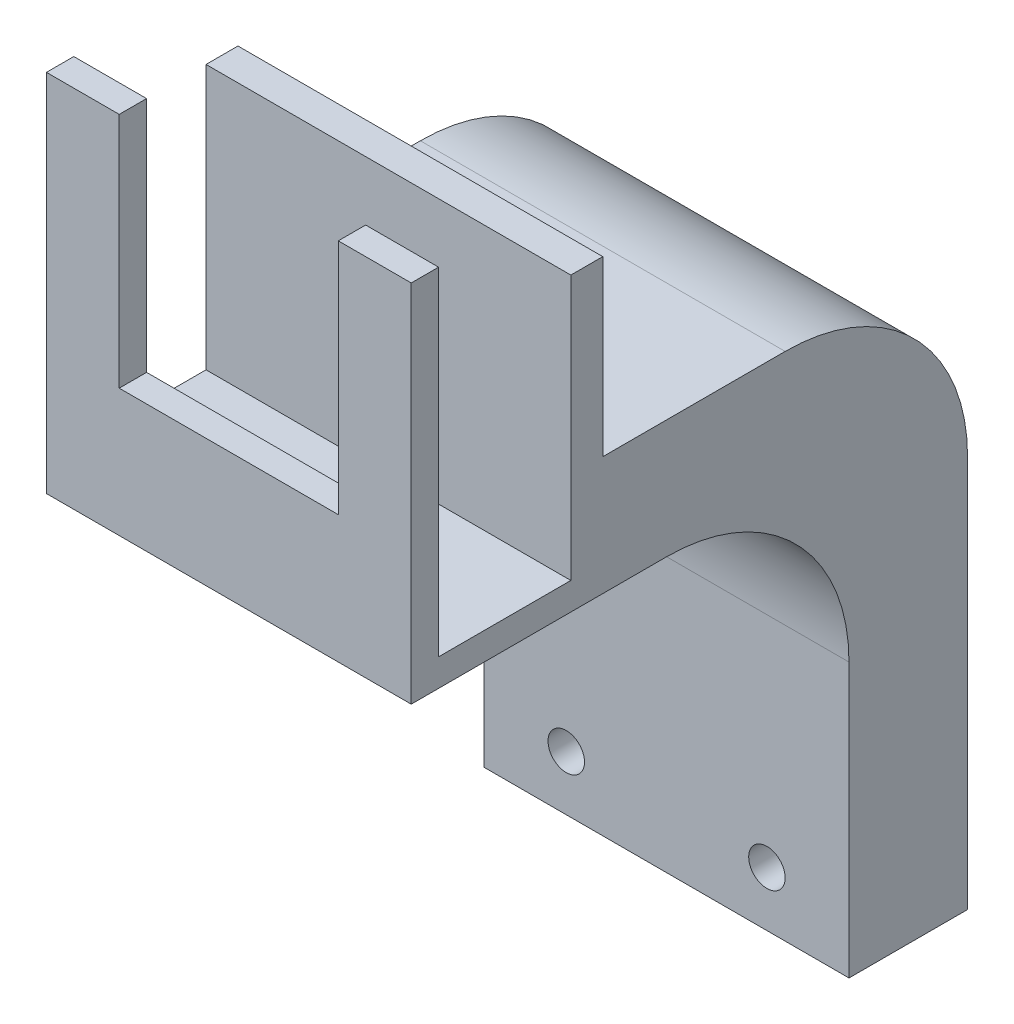
ISO-10303-21;
HEADER;
FILE_DESCRIPTION(('STEP AP214'),'2;1');
FILE_NAME('part.step','',(''),(''),'','','');
FILE_SCHEMA(('AUTOMOTIVE_DESIGN { 1 0 10303 214 1 1 1 1 }'));
ENDSEC;
DATA;
#1=APPLICATION_CONTEXT('core data for automotive mechanical design processes');
#2=APPLICATION_PROTOCOL_DEFINITION('international standard','automotive_design',2000,#1);
#3=PRODUCT_CONTEXT('',#1,'mechanical');
#4=PRODUCT('Part','Part','',(#3));
#5=PRODUCT_RELATED_PRODUCT_CATEGORY('part','',(#4));
#6=PRODUCT_DEFINITION_FORMATION('','',#4);
#7=PRODUCT_DEFINITION_CONTEXT('part definition',#1,'design');
#8=PRODUCT_DEFINITION('design','',#6,#7);
#9=PRODUCT_DEFINITION_SHAPE('','',#8);
#10=(LENGTH_UNIT() NAMED_UNIT(*) SI_UNIT(.MILLI.,.METRE.));
#11=(NAMED_UNIT(*) PLANE_ANGLE_UNIT() SI_UNIT($,.RADIAN.));
#12=(NAMED_UNIT(*) SI_UNIT($,.STERADIAN.) SOLID_ANGLE_UNIT());
#13=UNCERTAINTY_MEASURE_WITH_UNIT(LENGTH_MEASURE(1.E-05),#10,'distance_accuracy_value','');
#14=(GEOMETRIC_REPRESENTATION_CONTEXT(3) GLOBAL_UNCERTAINTY_ASSIGNED_CONTEXT((#13)) GLOBAL_UNIT_ASSIGNED_CONTEXT((#10,
#11,#12)) REPRESENTATION_CONTEXT('',''));
#15=CARTESIAN_POINT('',(0.,0.,0.));
#16=DIRECTION('',(0.,0.,1.));
#17=DIRECTION('',(1.,0.,0.));
#18=AXIS2_PLACEMENT_3D('',#15,#16,#17);
#19=CARTESIAN_POINT('',(0.,-7.,-20.));
#20=DIRECTION('',(1.,0.,0.));
#21=DIRECTION('',(0.,0.,-1.));
#22=AXIS2_PLACEMENT_3D('',#19,#20,#21);
#23=CYLINDRICAL_SURFACE('',#22,20.);
#24=DIRECTION('',(1.,0.,0.));
#25=VECTOR('',#24,1.);
#26=CARTESIAN_POINT('',(0.,-7.,-40.));
#27=LINE('',#26,#25);
#28=CARTESIAN_POINT('',(0.,-7.,-40.));
#29=VERTEX_POINT('',#28);
#30=CARTESIAN_POINT('',(40.,-7.,-40.));
#31=VERTEX_POINT('',#30);
#32=EDGE_CURVE('E359',#29,#31,#27,.T.);
#33=ORIENTED_EDGE('',*,*,#32,.F.);
#34=CARTESIAN_POINT('',(0.,-7.,-20.));
#35=DIRECTION('',(1.,0.,0.));
#36=DIRECTION('',(0.,0.,-1.));
#37=AXIS2_PLACEMENT_3D('',#34,#35,#36);
#38=CIRCLE('',#37,20.);
#39=CARTESIAN_POINT('',(0.,13.,-20.));
#40=VERTEX_POINT('',#39);
#41=EDGE_CURVE('E49',#40,#29,#38,.F.);
#42=ORIENTED_EDGE('',*,*,#41,.F.);
#43=DIRECTION('',(1.,0.,0.));
#44=VECTOR('',#43,1.);
#45=CARTESIAN_POINT('',(0.,13.,-20.));
#46=LINE('',#45,#44);
#47=CARTESIAN_POINT('',(40.,13.,-20.));
#48=VERTEX_POINT('',#47);
#49=EDGE_CURVE('E362',#48,#40,#46,.F.);
#50=ORIENTED_EDGE('',*,*,#49,.F.);
#51=CARTESIAN_POINT('',(40.,-7.,-20.));
#52=DIRECTION('',(-1.,0.,0.));
#53=DIRECTION('',(0.,0.,1.));
#54=AXIS2_PLACEMENT_3D('',#51,#52,#53);
#55=CIRCLE('',#54,20.);
#56=EDGE_CURVE('E11',#31,#48,#55,.F.);
#57=ORIENTED_EDGE('',*,*,#56,.F.);
#58=EDGE_LOOP('',(#33,#42,#50,#57));
#59=FACE_BOUND('',#58,.T.);
#60=ADVANCED_FACE('F41',(#59),#23,.T.);
#61=CARTESIAN_POINT('',(0.,-20.,-7.));
#62=DIRECTION('',(1.,0.,0.));
#63=DIRECTION('',(0.,0.,-1.));
#64=AXIS2_PLACEMENT_3D('',#61,#62,#63);
#65=CYLINDRICAL_SURFACE('',#64,20.);
#66=DIRECTION('',(-1.,0.,0.));
#67=VECTOR('',#66,1.);
#68=CARTESIAN_POINT('',(0.,-20.,-27.));
#69=LINE('',#68,#67);
#70=CARTESIAN_POINT('',(40.,-20.,-27.));
#71=VERTEX_POINT('',#70);
#72=CARTESIAN_POINT('',(0.,-20.,-27.));
#73=VERTEX_POINT('',#72);
#74=EDGE_CURVE('E345',#71,#73,#69,.T.);
#75=ORIENTED_EDGE('',*,*,#74,.F.);
#76=CARTESIAN_POINT('',(40.,-20.,-7.));
#77=DIRECTION('',(-1.,0.,0.));
#78=DIRECTION('',(0.,0.,1.));
#79=AXIS2_PLACEMENT_3D('',#76,#77,#78);
#80=CIRCLE('',#79,20.);
#81=CARTESIAN_POINT('',(40.,0.,-7.));
#82=VERTEX_POINT('',#81);
#83=EDGE_CURVE('E353',#71,#82,#80,.F.);
#84=ORIENTED_EDGE('',*,*,#83,.T.);
#85=DIRECTION('',(-1.,0.,0.));
#86=VECTOR('',#85,1.);
#87=CARTESIAN_POINT('',(0.,0.,-7.));
#88=LINE('',#87,#86);
#89=CARTESIAN_POINT('',(0.,0.,-6.99999999999999));
#90=VERTEX_POINT('',#89);
#91=EDGE_CURVE('E349',#90,#82,#88,.F.);
#92=ORIENTED_EDGE('',*,*,#91,.F.);
#93=CARTESIAN_POINT('',(0.,-20.,-7.));
#94=DIRECTION('',(1.,0.,0.));
#95=DIRECTION('',(0.,0.,-1.));
#96=AXIS2_PLACEMENT_3D('',#93,#94,#95);
#97=CIRCLE('',#96,20.);
#98=EDGE_CURVE('E356',#90,#73,#97,.F.);
#99=ORIENTED_EDGE('',*,*,#98,.T.);
#100=EDGE_LOOP('',(#75,#84,#92,#99));
#101=FACE_BOUND('',#100,.T.);
#102=ADVANCED_FACE('F392',(#101),#65,.F.);
#103=CARTESIAN_POINT('',(0.,0.,21.));
#104=DIRECTION('',(0.,1.,0.));
#105=DIRECTION('',(0.,0.,1.));
#106=AXIS2_PLACEMENT_3D('',#103,#104,#105);
#107=PLANE('',#106);
#108=DIRECTION('',(0.,0.,-1.));
#109=VECTOR('',#108,1.);
#110=CARTESIAN_POINT('',(0.,0.,21.));
#111=LINE('',#110,#109);
#112=CARTESIAN_POINT('',(0.,0.,21.));
#113=VERTEX_POINT('',#112);
#114=EDGE_CURVE('E337',#113,#90,#111,.T.);
#115=ORIENTED_EDGE('',*,*,#114,.T.);
#116=ORIENTED_EDGE('',*,*,#91,.T.);
#117=DIRECTION('',(0.,0.,-1.));
#118=VECTOR('',#117,1.);
#119=CARTESIAN_POINT('',(40.,0.,21.));
#120=LINE('',#119,#118);
#121=CARTESIAN_POINT('',(40.,0.,21.));
#122=VERTEX_POINT('',#121);
#123=EDGE_CURVE('E333',#122,#82,#120,.T.);
#124=ORIENTED_EDGE('',*,*,#123,.F.);
#125=DIRECTION('',(1.,0.,0.));
#126=VECTOR('',#125,1.);
#127=CARTESIAN_POINT('',(0.,0.,21.));
#128=LINE('',#127,#126);
#129=EDGE_CURVE('E308',#113,#122,#128,.T.);
#130=ORIENTED_EDGE('',*,*,#129,.F.);
#131=EDGE_LOOP('',(#115,#116,#124,#130));
#132=FACE_BOUND('',#131,.T.);
#133=ADVANCED_FACE('F388',(#132),#107,.F.);
#134=CARTESIAN_POINT('',(40.,40.,21.));
#135=DIRECTION('',(0.,-1.,0.));
#136=DIRECTION('',(0.,0.,-1.));
#137=AXIS2_PLACEMENT_3D('',#134,#135,#136);
#138=PLANE('',#137);
#139=DIRECTION('',(0.,0.,1.));
#140=VECTOR('',#139,1.);
#141=CARTESIAN_POINT('',(32.,40.,-0.001000000000001));
#142=LINE('',#141,#140);
#143=CARTESIAN_POINT('',(32.,40.,18.));
#144=VERTEX_POINT('',#143);
#145=CARTESIAN_POINT('',(32.,40.,21.));
#146=VERTEX_POINT('',#145);
#147=EDGE_CURVE('E241',#144,#146,#142,.T.);
#148=ORIENTED_EDGE('',*,*,#147,.T.);
#149=DIRECTION('',(-1.,0.,0.));
#150=VECTOR('',#149,1.);
#151=CARTESIAN_POINT('',(40.,40.,21.));
#152=LINE('',#151,#150);
#153=CARTESIAN_POINT('',(40.,40.,21.));
#154=VERTEX_POINT('',#153);
#155=EDGE_CURVE('E316',#154,#146,#152,.T.);
#156=ORIENTED_EDGE('',*,*,#155,.F.);
#157=DIRECTION('',(0.,0.,-1.));
#158=VECTOR('',#157,1.);
#159=CARTESIAN_POINT('',(40.,40.,21.));
#160=LINE('',#159,#158);
#161=CARTESIAN_POINT('',(40.,40.,18.));
#162=VERTEX_POINT('',#161);
#163=EDGE_CURVE('E329',#154,#162,#160,.T.);
#164=ORIENTED_EDGE('',*,*,#163,.T.);
#165=DIRECTION('',(1.,0.,0.));
#166=VECTOR('',#165,1.);
#167=CARTESIAN_POINT('',(0.,40.,18.));
#168=LINE('',#167,#166);
#169=EDGE_CURVE('E282',#144,#162,#168,.T.);
#170=ORIENTED_EDGE('',*,*,#169,.F.);
#171=EDGE_LOOP('',(#148,#156,#164,#170));
#172=FACE_BOUND('',#171,.T.);
#173=ADVANCED_FACE('F380',(#172),#138,.F.);
#174=DIRECTION('',(0.,0.,1.));
#175=VECTOR('',#174,1.);
#176=CARTESIAN_POINT('',(7.9821955875414,40.,-0.001000000000001));
#177=LINE('',#176,#175);
#178=CARTESIAN_POINT('',(7.9821955875414,40.,18.));
#179=VERTEX_POINT('',#178);
#180=CARTESIAN_POINT('',(7.9821955875414,40.,21.));
#181=VERTEX_POINT('',#180);
#182=EDGE_CURVE('E240',#179,#181,#177,.T.);
#183=ORIENTED_EDGE('',*,*,#182,.F.);
#184=CARTESIAN_POINT('',(0.,40.,18.));
#185=VERTEX_POINT('',#184);
#186=EDGE_CURVE('E300',#185,#179,#168,.T.);
#187=ORIENTED_EDGE('',*,*,#186,.F.);
#188=DIRECTION('',(0.,0.,-1.));
#189=VECTOR('',#188,1.);
#190=CARTESIAN_POINT('',(0.,40.,21.));
#191=LINE('',#190,#189);
#192=CARTESIAN_POINT('',(0.,40.,21.));
#193=VERTEX_POINT('',#192);
#194=EDGE_CURVE('E320',#193,#185,#191,.T.);
#195=ORIENTED_EDGE('',*,*,#194,.F.);
#196=EDGE_CURVE('E315',#181,#193,#152,.T.);
#197=ORIENTED_EDGE('',*,*,#196,.F.);
#198=EDGE_LOOP('',(#183,#187,#195,#197));
#199=FACE_BOUND('',#198,.T.);
#200=ADVANCED_FACE('F402',(#199),#138,.F.);
#201=CARTESIAN_POINT('',(0.,0.,21.));
#202=DIRECTION('',(0.,0.,1.));
#203=DIRECTION('',(1.,0.,0.));
#204=AXIS2_PLACEMENT_3D('',#201,#202,#203);
#205=PLANE('',#204);
#206=ORIENTED_EDGE('',*,*,#155,.T.);
#207=DIRECTION('',(0.,-1.,0.));
#208=VECTOR('',#207,1.);
#209=CARTESIAN_POINT('',(32.,0.,21.));
#210=LINE('',#209,#208);
#211=CARTESIAN_POINT('',(32.,14.,21.));
#212=VERTEX_POINT('',#211);
#213=EDGE_CURVE('E236',#146,#212,#210,.T.);
#214=ORIENTED_EDGE('',*,*,#213,.T.);
#215=DIRECTION('',(1.,0.,0.));
#216=VECTOR('',#215,1.);
#217=CARTESIAN_POINT('',(0.,14.,21.));
#218=LINE('',#217,#216);
#219=CARTESIAN_POINT('',(7.9821955875414,14.,21.));
#220=VERTEX_POINT('',#219);
#221=EDGE_CURVE('E235',#220,#212,#218,.T.);
#222=ORIENTED_EDGE('',*,*,#221,.F.);
#223=DIRECTION('',(0.,1.,0.));
#224=VECTOR('',#223,1.);
#225=CARTESIAN_POINT('',(7.9821955875414,0.,21.));
#226=LINE('',#225,#224);
#227=EDGE_CURVE('E246',#220,#181,#226,.T.);
#228=ORIENTED_EDGE('',*,*,#227,.T.);
#229=ORIENTED_EDGE('',*,*,#196,.T.);
#230=DIRECTION('',(0.,-1.,0.));
#231=VECTOR('',#230,1.);
#232=CARTESIAN_POINT('',(0.,40.,21.));
#233=LINE('',#232,#231);
#234=EDGE_CURVE('E304',#193,#113,#233,.T.);
#235=ORIENTED_EDGE('',*,*,#234,.T.);
#236=ORIENTED_EDGE('',*,*,#129,.T.);
#237=DIRECTION('',(0.,1.,0.));
#238=VECTOR('',#237,1.);
#239=CARTESIAN_POINT('',(40.,0.,21.));
#240=LINE('',#239,#238);
#241=EDGE_CURVE('E312',#122,#154,#240,.T.);
#242=ORIENTED_EDGE('',*,*,#241,.T.);
#243=EDGE_LOOP('',(#206,#214,#222,#228,#229,#235,#236,#242));
#244=FACE_BOUND('',#243,.T.);
#245=ADVANCED_FACE('F382',(#244),#205,.T.);
#246=CARTESIAN_POINT('',(0.,3.,18.));
#247=DIRECTION('',(0.,0.,1.));
#248=DIRECTION('',(1.,0.,0.));
#249=AXIS2_PLACEMENT_3D('',#246,#247,#248);
#250=PLANE('',#249);
#251=DIRECTION('',(0.,1.,0.));
#252=VECTOR('',#251,1.);
#253=CARTESIAN_POINT('',(32.,0.,18.));
#254=LINE('',#253,#252);
#255=CARTESIAN_POINT('',(32.,14.,18.));
#256=VERTEX_POINT('',#255);
#257=EDGE_CURVE('E256',#256,#144,#254,.T.);
#258=ORIENTED_EDGE('',*,*,#257,.T.);
#259=ORIENTED_EDGE('',*,*,#169,.T.);
#260=DIRECTION('',(0.,-1.,0.));
#261=VECTOR('',#260,1.);
#262=CARTESIAN_POINT('',(40.,3.,18.));
#263=LINE('',#262,#261);
#264=CARTESIAN_POINT('',(40.,3.,18.));
#265=VERTEX_POINT('',#264);
#266=EDGE_CURVE('E250',#162,#265,#263,.T.);
#267=ORIENTED_EDGE('',*,*,#266,.T.);
#268=DIRECTION('',(1.,0.,0.));
#269=VECTOR('',#268,1.);
#270=CARTESIAN_POINT('',(0.,3.,18.));
#271=LINE('',#270,#269);
#272=CARTESIAN_POINT('',(0.,3.,18.));
#273=VERTEX_POINT('',#272);
#274=EDGE_CURVE('E297',#273,#265,#271,.T.);
#275=ORIENTED_EDGE('',*,*,#274,.F.);
#276=DIRECTION('',(0.,-1.,0.));
#277=VECTOR('',#276,1.);
#278=CARTESIAN_POINT('',(0.,3.,18.));
#279=LINE('',#278,#277);
#280=EDGE_CURVE('E269',#185,#273,#279,.T.);
#281=ORIENTED_EDGE('',*,*,#280,.F.);
#282=ORIENTED_EDGE('',*,*,#186,.T.);
#283=DIRECTION('',(0.,-1.,0.));
#284=VECTOR('',#283,1.);
#285=CARTESIAN_POINT('',(7.9821955875414,0.,18.));
#286=LINE('',#285,#284);
#287=CARTESIAN_POINT('',(7.9821955875414,14.,18.));
#288=VERTEX_POINT('',#287);
#289=EDGE_CURVE('E252',#179,#288,#286,.T.);
#290=ORIENTED_EDGE('',*,*,#289,.T.);
#291=DIRECTION('',(-1.,0.,0.));
#292=VECTOR('',#291,1.);
#293=CARTESIAN_POINT('',(0.,14.,18.));
#294=LINE('',#293,#292);
#295=EDGE_CURVE('E229',#256,#288,#294,.T.);
#296=ORIENTED_EDGE('',*,*,#295,.F.);
#297=EDGE_LOOP('',(#258,#259,#267,#275,#281,#282,#290,#296));
#298=FACE_BOUND('',#297,.T.);
#299=ADVANCED_FACE('F370',(#298),#250,.F.);
#300=CARTESIAN_POINT('',(0.,40.,21.));
#301=DIRECTION('',(1.,0.,0.));
#302=DIRECTION('',(0.,0.,-1.));
#303=AXIS2_PLACEMENT_3D('',#300,#301,#302);
#304=PLANE('',#303);
#305=DIRECTION('',(0.,0.,1.));
#306=VECTOR('',#305,1.);
#307=CARTESIAN_POINT('',(0.,13.,-40.));
#308=LINE('',#307,#306);
#309=CARTESIAN_POINT('',(0.,13.,0.));
#310=VERTEX_POINT('',#309);
#311=EDGE_CURVE('E173',#40,#310,#308,.T.);
#312=ORIENTED_EDGE('',*,*,#311,.F.);
#313=ORIENTED_EDGE('',*,*,#41,.T.);
#314=DIRECTION('',(0.,1.,0.));
#315=VECTOR('',#314,1.);
#316=CARTESIAN_POINT('',(0.,0.,-40.));
#317=LINE('',#316,#315);
#318=CARTESIAN_POINT('',(0.,-50.,-40.));
#319=VERTEX_POINT('',#318);
#320=EDGE_CURVE('E163',#319,#29,#317,.T.);
#321=ORIENTED_EDGE('',*,*,#320,.F.);
#322=DIRECTION('',(0.,0.,-1.));
#323=VECTOR('',#322,1.);
#324=CARTESIAN_POINT('',(0.,-50.,-27.));
#325=LINE('',#324,#323);
#326=CARTESIAN_POINT('',(0.,-50.,-27.));
#327=VERTEX_POINT('',#326);
#328=EDGE_CURVE('E169',#327,#319,#325,.T.);
#329=ORIENTED_EDGE('',*,*,#328,.F.);
#330=DIRECTION('',(0.,1.,0.));
#331=VECTOR('',#330,1.);
#332=CARTESIAN_POINT('',(0.,-50.,-27.));
#333=LINE('',#332,#331);
#334=EDGE_CURVE('E203',#327,#73,#333,.T.);
#335=ORIENTED_EDGE('',*,*,#334,.T.);
#336=ORIENTED_EDGE('',*,*,#98,.F.);
#337=ORIENTED_EDGE('',*,*,#114,.F.);
#338=ORIENTED_EDGE('',*,*,#234,.F.);
#339=ORIENTED_EDGE('',*,*,#194,.T.);
#340=ORIENTED_EDGE('',*,*,#280,.T.);
#341=DIRECTION('',(0.,0.,-1.));
#342=VECTOR('',#341,1.);
#343=CARTESIAN_POINT('',(0.,3.,3.5));
#344=LINE('',#343,#342);
#345=CARTESIAN_POINT('',(0.,3.,3.5));
#346=VERTEX_POINT('',#345);
#347=EDGE_CURVE('E273',#273,#346,#344,.T.);
#348=ORIENTED_EDGE('',*,*,#347,.T.);
#349=DIRECTION('',(0.,1.,0.));
#350=VECTOR('',#349,1.);
#351=CARTESIAN_POINT('',(0.,40.,3.5));
#352=LINE('',#351,#350);
#353=CARTESIAN_POINT('',(0.,32.,3.5));
#354=VERTEX_POINT('',#353);
#355=EDGE_CURVE('E278',#346,#354,#352,.T.);
#356=ORIENTED_EDGE('',*,*,#355,.T.);
#357=DIRECTION('',(0.,0.,-1.));
#358=VECTOR('',#357,1.);
#359=CARTESIAN_POINT('',(0.,32.,16.));
#360=LINE('',#359,#358);
#361=CARTESIAN_POINT('',(0.,32.,0.));
#362=VERTEX_POINT('',#361);
#363=EDGE_CURVE('E225',#354,#362,#360,.T.);
#364=ORIENTED_EDGE('',*,*,#363,.T.);
#365=DIRECTION('',(0.,-1.,0.));
#366=VECTOR('',#365,1.);
#367=CARTESIAN_POINT('',(0.,40.,0.));
#368=LINE('',#367,#366);
#369=EDGE_CURVE('E296',#362,#310,#368,.T.);
#370=ORIENTED_EDGE('',*,*,#369,.T.);
#371=EDGE_LOOP('',(#312,#313,#321,#329,#335,#336,#337,#338,#339,#340,#348,#356,#364,#370));
#372=FACE_BOUND('',#371,.T.);
#373=ADVANCED_FACE('F166',(#372),#304,.F.);
#374=CARTESIAN_POINT('',(40.,0.,21.));
#375=DIRECTION('',(-1.,0.,0.));
#376=DIRECTION('',(0.,0.,1.));
#377=AXIS2_PLACEMENT_3D('',#374,#375,#376);
#378=PLANE('',#377);
#379=DIRECTION('',(0.,-1.,0.));
#380=VECTOR('',#379,1.);
#381=CARTESIAN_POINT('',(40.,0.,-40.));
#382=LINE('',#381,#380);
#383=CARTESIAN_POINT('',(40.,-50.,-40.));
#384=VERTEX_POINT('',#383);
#385=EDGE_CURVE('E174',#31,#384,#382,.T.);
#386=ORIENTED_EDGE('',*,*,#385,.F.);
#387=ORIENTED_EDGE('',*,*,#56,.T.);
#388=DIRECTION('',(0.,0.,1.));
#389=VECTOR('',#388,1.);
#390=CARTESIAN_POINT('',(40.,13.,-40.));
#391=LINE('',#390,#389);
#392=CARTESIAN_POINT('',(40.,13.,0.));
#393=VERTEX_POINT('',#392);
#394=EDGE_CURVE('E218',#48,#393,#391,.T.);
#395=ORIENTED_EDGE('',*,*,#394,.T.);
#396=DIRECTION('',(0.,1.,0.));
#397=VECTOR('',#396,1.);
#398=CARTESIAN_POINT('',(40.,0.,0.));
#399=LINE('',#398,#397);
#400=CARTESIAN_POINT('',(40.,32.,0.));
#401=VERTEX_POINT('',#400);
#402=EDGE_CURVE('E309',#393,#401,#399,.T.);
#403=ORIENTED_EDGE('',*,*,#402,.T.);
#404=DIRECTION('',(0.,0.,-1.));
#405=VECTOR('',#404,1.);
#406=CARTESIAN_POINT('',(40.,32.,16.));
#407=LINE('',#406,#405);
#408=CARTESIAN_POINT('',(40.,32.,3.5));
#409=VERTEX_POINT('',#408);
#410=EDGE_CURVE('E224',#409,#401,#407,.T.);
#411=ORIENTED_EDGE('',*,*,#410,.F.);
#412=DIRECTION('',(0.,1.,0.));
#413=VECTOR('',#412,1.);
#414=CARTESIAN_POINT('',(40.,40.,3.5));
#415=LINE('',#414,#413);
#416=CARTESIAN_POINT('',(40.,3.,3.5));
#417=VERTEX_POINT('',#416);
#418=EDGE_CURVE('E274',#417,#409,#415,.T.);
#419=ORIENTED_EDGE('',*,*,#418,.F.);
#420=DIRECTION('',(0.,0.,-1.));
#421=VECTOR('',#420,1.);
#422=CARTESIAN_POINT('',(40.,3.,3.5));
#423=LINE('',#422,#421);
#424=EDGE_CURVE('E286',#265,#417,#423,.T.);
#425=ORIENTED_EDGE('',*,*,#424,.F.);
#426=ORIENTED_EDGE('',*,*,#266,.F.);
#427=ORIENTED_EDGE('',*,*,#163,.F.);
#428=ORIENTED_EDGE('',*,*,#241,.F.);
#429=ORIENTED_EDGE('',*,*,#123,.T.);
#430=ORIENTED_EDGE('',*,*,#83,.F.);
#431=DIRECTION('',(0.,1.,0.));
#432=VECTOR('',#431,1.);
#433=CARTESIAN_POINT('',(40.,-50.,-27.));
#434=LINE('',#433,#432);
#435=CARTESIAN_POINT('',(40.,-50.,-27.));
#436=VERTEX_POINT('',#435);
#437=EDGE_CURVE('E206',#436,#71,#434,.T.);
#438=ORIENTED_EDGE('',*,*,#437,.F.);
#439=DIRECTION('',(0.,0.,1.));
#440=VECTOR('',#439,1.);
#441=CARTESIAN_POINT('',(40.,-50.,-27.));
#442=LINE('',#441,#440);
#443=EDGE_CURVE('E182',#384,#436,#442,.T.);
#444=ORIENTED_EDGE('',*,*,#443,.F.);
#445=EDGE_LOOP('',(#386,#387,#395,#403,#411,#419,#425,#426,#427,#428,#429,#430,#438,#444));
#446=FACE_BOUND('',#445,.T.);
#447=ADVANCED_FACE('F376',(#446),#378,.F.);
#448=CARTESIAN_POINT('',(0.,0.,0.));
#449=DIRECTION('',(0.,0.,1.));
#450=DIRECTION('',(1.,0.,0.));
#451=AXIS2_PLACEMENT_3D('',#448,#449,#450);
#452=PLANE('',#451);
#453=ORIENTED_EDGE('',*,*,#402,.F.);
#454=DIRECTION('',(-1.,0.,0.));
#455=VECTOR('',#454,1.);
#456=CARTESIAN_POINT('',(0.,13.,0.));
#457=LINE('',#456,#455);
#458=EDGE_CURVE('E210',#393,#310,#457,.T.);
#459=ORIENTED_EDGE('',*,*,#458,.T.);
#460=ORIENTED_EDGE('',*,*,#369,.F.);
#461=DIRECTION('',(-1.,0.,0.));
#462=VECTOR('',#461,1.);
#463=CARTESIAN_POINT('',(40.,32.,0.));
#464=LINE('',#463,#462);
#465=EDGE_CURVE('E221',#401,#362,#464,.T.);
#466=ORIENTED_EDGE('',*,*,#465,.F.);
#467=EDGE_LOOP('',(#453,#459,#460,#466));
#468=FACE_BOUND('',#467,.T.);
#469=ADVANCED_FACE('F417',(#468),#452,.F.);
#470=CARTESIAN_POINT('',(0.,40.,3.5));
#471=DIRECTION('',(0.,0.,-1.));
#472=DIRECTION('',(0.,1.,0.));
#473=AXIS2_PLACEMENT_3D('',#470,#471,#472);
#474=PLANE('',#473);
#475=ORIENTED_EDGE('',*,*,#418,.T.);
#476=DIRECTION('',(-1.,0.,0.));
#477=VECTOR('',#476,1.);
#478=CARTESIAN_POINT('',(0.,32.,3.5));
#479=LINE('',#478,#477);
#480=EDGE_CURVE('E341',#409,#354,#479,.T.);
#481=ORIENTED_EDGE('',*,*,#480,.T.);
#482=ORIENTED_EDGE('',*,*,#355,.F.);
#483=DIRECTION('',(1.,0.,0.));
#484=VECTOR('',#483,1.);
#485=CARTESIAN_POINT('',(0.,3.,3.5));
#486=LINE('',#485,#484);
#487=EDGE_CURVE('E293',#346,#417,#486,.T.);
#488=ORIENTED_EDGE('',*,*,#487,.T.);
#489=EDGE_LOOP('',(#475,#481,#482,#488));
#490=FACE_BOUND('',#489,.T.);
#491=ADVANCED_FACE('F408',(#490),#474,.F.);
#492=CARTESIAN_POINT('',(0.,3.,3.5));
#493=DIRECTION('',(0.,-1.,0.));
#494=DIRECTION('',(0.,0.,-1.));
#495=AXIS2_PLACEMENT_3D('',#492,#493,#494);
#496=PLANE('',#495);
#497=ORIENTED_EDGE('',*,*,#424,.T.);
#498=ORIENTED_EDGE('',*,*,#487,.F.);
#499=ORIENTED_EDGE('',*,*,#347,.F.);
#500=ORIENTED_EDGE('',*,*,#274,.T.);
#501=EDGE_LOOP('',(#497,#498,#499,#500));
#502=FACE_BOUND('',#501,.T.);
#503=ADVANCED_FACE('F406',(#502),#496,.F.);
#504=CARTESIAN_POINT('',(0.,14.,-0.001000000000001));
#505=DIRECTION('',(0.,-1.,0.));
#506=DIRECTION('',(0.,0.,-1.));
#507=AXIS2_PLACEMENT_3D('',#504,#505,#506);
#508=PLANE('',#507);
#509=ORIENTED_EDGE('',*,*,#295,.T.);
#510=DIRECTION('',(0.,0.,1.));
#511=VECTOR('',#510,1.);
#512=CARTESIAN_POINT('',(7.9821955875414,14.,-0.001000000000001));
#513=LINE('',#512,#511);
#514=EDGE_CURVE('E251',#288,#220,#513,.T.);
#515=ORIENTED_EDGE('',*,*,#514,.T.);
#516=ORIENTED_EDGE('',*,*,#221,.T.);
#517=DIRECTION('',(0.,0.,1.));
#518=VECTOR('',#517,1.);
#519=CARTESIAN_POINT('',(32.,14.,-0.001000000000001));
#520=LINE('',#519,#518);
#521=EDGE_CURVE('E245',#256,#212,#520,.T.);
#522=ORIENTED_EDGE('',*,*,#521,.F.);
#523=EDGE_LOOP('',(#509,#515,#516,#522));
#524=FACE_BOUND('',#523,.T.);
#525=ADVANCED_FACE('F444',(#524),#508,.F.);
#526=CARTESIAN_POINT('',(32.,0.,-0.001000000000001));
#527=DIRECTION('',(-1.,0.,0.));
#528=DIRECTION('',(0.,0.,1.));
#529=AXIS2_PLACEMENT_3D('',#526,#527,#528);
#530=PLANE('',#529);
#531=ORIENTED_EDGE('',*,*,#521,.T.);
#532=ORIENTED_EDGE('',*,*,#213,.F.);
#533=ORIENTED_EDGE('',*,*,#147,.F.);
#534=ORIENTED_EDGE('',*,*,#257,.F.);
#535=EDGE_LOOP('',(#531,#532,#533,#534));
#536=FACE_BOUND('',#535,.T.);
#537=ADVANCED_FACE('F449',(#536),#530,.T.);
#538=CARTESIAN_POINT('',(7.9821955875414,0.,-0.001000000000001));
#539=DIRECTION('',(1.,0.,0.));
#540=DIRECTION('',(0.,0.,-1.));
#541=AXIS2_PLACEMENT_3D('',#538,#539,#540);
#542=PLANE('',#541);
#543=ORIENTED_EDGE('',*,*,#182,.T.);
#544=ORIENTED_EDGE('',*,*,#227,.F.);
#545=ORIENTED_EDGE('',*,*,#514,.F.);
#546=ORIENTED_EDGE('',*,*,#289,.F.);
#547=EDGE_LOOP('',(#543,#544,#545,#546));
#548=FACE_BOUND('',#547,.T.);
#549=ADVANCED_FACE('F453',(#548),#542,.T.);
#550=CARTESIAN_POINT('',(40.,32.,16.));
#551=DIRECTION('',(0.,-1.,0.));
#552=DIRECTION('',(0.,0.,-1.));
#553=AXIS2_PLACEMENT_3D('',#550,#551,#552);
#554=PLANE('',#553);
#555=ORIENTED_EDGE('',*,*,#410,.T.);
#556=ORIENTED_EDGE('',*,*,#465,.T.);
#557=ORIENTED_EDGE('',*,*,#363,.F.);
#558=ORIENTED_EDGE('',*,*,#480,.F.);
#559=EDGE_LOOP('',(#555,#556,#557,#558));
#560=FACE_BOUND('',#559,.T.);
#561=ADVANCED_FACE('F411',(#560),#554,.F.);
#562=CARTESIAN_POINT('',(0.,13.,-40.));
#563=DIRECTION('',(0.,1.,0.));
#564=DIRECTION('',(0.,0.,1.));
#565=AXIS2_PLACEMENT_3D('',#562,#563,#564);
#566=PLANE('',#565);
#567=ORIENTED_EDGE('',*,*,#394,.F.);
#568=ORIENTED_EDGE('',*,*,#49,.T.);
#569=ORIENTED_EDGE('',*,*,#311,.T.);
#570=ORIENTED_EDGE('',*,*,#458,.F.);
#571=EDGE_LOOP('',(#567,#568,#569,#570));
#572=FACE_BOUND('',#571,.T.);
#573=ADVANCED_FACE('F420',(#572),#566,.T.);
#574=CARTESIAN_POINT('',(0.,0.,-40.));
#575=DIRECTION('',(0.,0.,-1.));
#576=DIRECTION('',(-1.,0.,0.));
#577=AXIS2_PLACEMENT_3D('',#574,#575,#576);
#578=PLANE('',#577);
#579=CARTESIAN_POINT('',(31.,-44.,-40.));
#580=DIRECTION('',(0.,0.,-1.));
#581=DIRECTION('',(-1.,0.,0.));
#582=AXIS2_PLACEMENT_3D('',#579,#580,#581);
#583=CIRCLE('',#582,2.);
#584=CARTESIAN_POINT('',(29.,-44.,-40.));
#585=VERTEX_POINT('',#584);
#586=EDGE_CURVE('E193',#585,#585,#583,.T.);
#587=ORIENTED_EDGE('',*,*,#586,.F.);
#588=EDGE_LOOP('',(#587));
#589=FACE_BOUND('',#588,.T.);
#590=CARTESIAN_POINT('',(9.,-44.,-40.));
#591=DIRECTION('',(0.,0.,-1.));
#592=DIRECTION('',(-1.,0.,0.));
#593=AXIS2_PLACEMENT_3D('',#590,#591,#592);
#594=CIRCLE('',#593,2.);
#595=CARTESIAN_POINT('',(7.,-44.,-40.));
#596=VERTEX_POINT('',#595);
#597=EDGE_CURVE('E488',#596,#596,#594,.T.);
#598=ORIENTED_EDGE('',*,*,#597,.F.);
#599=EDGE_LOOP('',(#598));
#600=FACE_BOUND('',#599,.T.);
#601=ORIENTED_EDGE('',*,*,#320,.T.);
#602=ORIENTED_EDGE('',*,*,#32,.T.);
#603=ORIENTED_EDGE('',*,*,#385,.T.);
#604=DIRECTION('',(1.,0.,0.));
#605=VECTOR('',#604,1.);
#606=CARTESIAN_POINT('',(0.,-50.,-40.));
#607=LINE('',#606,#605);
#608=EDGE_CURVE('E177',#319,#384,#607,.T.);
#609=ORIENTED_EDGE('',*,*,#608,.F.);
#610=EDGE_LOOP('',(#601,#602,#603,#609));
#611=FACE_BOUND('',#610,.T.);
#612=ADVANCED_FACE('F178',(#589,#600,#611),#578,.T.);
#613=CARTESIAN_POINT('',(0.,-50.,-27.));
#614=DIRECTION('',(0.,0.,-1.));
#615=DIRECTION('',(-1.,0.,0.));
#616=AXIS2_PLACEMENT_3D('',#613,#614,#615);
#617=PLANE('',#616);
#618=CARTESIAN_POINT('',(31.,-44.,-27.));
#619=DIRECTION('',(0.,0.,-1.));
#620=DIRECTION('',(-1.,0.,0.));
#621=AXIS2_PLACEMENT_3D('',#618,#619,#620);
#622=CIRCLE('',#621,2.);
#623=CARTESIAN_POINT('',(29.,-44.,-27.));
#624=VERTEX_POINT('',#623);
#625=EDGE_CURVE('E189',#624,#624,#622,.F.);
#626=ORIENTED_EDGE('',*,*,#625,.F.);
#627=EDGE_LOOP('',(#626));
#628=FACE_BOUND('',#627,.T.);
#629=CARTESIAN_POINT('',(9.,-44.,-27.));
#630=DIRECTION('',(0.,0.,-1.));
#631=DIRECTION('',(-1.,0.,0.));
#632=AXIS2_PLACEMENT_3D('',#629,#630,#631);
#633=CIRCLE('',#632,2.);
#634=CARTESIAN_POINT('',(7.,-44.,-27.));
#635=VERTEX_POINT('',#634);
#636=EDGE_CURVE('E196',#635,#635,#633,.F.);
#637=ORIENTED_EDGE('',*,*,#636,.F.);
#638=EDGE_LOOP('',(#637));
#639=FACE_BOUND('',#638,.T.);
#640=ORIENTED_EDGE('',*,*,#437,.T.);
#641=ORIENTED_EDGE('',*,*,#74,.T.);
#642=ORIENTED_EDGE('',*,*,#334,.F.);
#643=DIRECTION('',(-1.,0.,0.));
#644=VECTOR('',#643,1.);
#645=CARTESIAN_POINT('',(0.,-50.,-27.));
#646=LINE('',#645,#644);
#647=EDGE_CURVE('E186',#436,#327,#646,.T.);
#648=ORIENTED_EDGE('',*,*,#647,.F.);
#649=EDGE_LOOP('',(#640,#641,#642,#648));
#650=FACE_BOUND('',#649,.T.);
#651=ADVANCED_FACE('F394',(#628,#639,#650),#617,.F.);
#652=CARTESIAN_POINT('',(0.,-50.,0.));
#653=DIRECTION('',(0.,-1.,0.));
#654=DIRECTION('',(0.,0.,-1.));
#655=AXIS2_PLACEMENT_3D('',#652,#653,#654);
#656=PLANE('',#655);
#657=ORIENTED_EDGE('',*,*,#328,.T.);
#658=ORIENTED_EDGE('',*,*,#608,.T.);
#659=ORIENTED_EDGE('',*,*,#443,.T.);
#660=ORIENTED_EDGE('',*,*,#647,.T.);
#661=EDGE_LOOP('',(#657,#658,#659,#660));
#662=FACE_BOUND('',#661,.T.);
#663=ADVANCED_FACE('F184',(#662),#656,.T.);
#664=CARTESIAN_POINT('',(9.,-44.,21.001));
#665=DIRECTION('',(0.,0.,-1.));
#666=DIRECTION('',(-1.,0.,0.));
#667=AXIS2_PLACEMENT_3D('',#664,#665,#666);
#668=CYLINDRICAL_SURFACE('',#667,2.);
#669=ORIENTED_EDGE('',*,*,#597,.T.);
#670=EDGE_LOOP('',(#669));
#671=FACE_BOUND('',#670,.T.);
#672=ORIENTED_EDGE('',*,*,#636,.T.);
#673=EDGE_LOOP('',(#672));
#674=FACE_BOUND('',#673,.T.);
#675=ADVANCED_FACE('F470',(#671,#674),#668,.F.);
#676=CARTESIAN_POINT('',(31.,-44.,21.001));
#677=DIRECTION('',(0.,0.,-1.));
#678=DIRECTION('',(-1.,0.,0.));
#679=AXIS2_PLACEMENT_3D('',#676,#677,#678);
#680=CYLINDRICAL_SURFACE('',#679,2.);
#681=ORIENTED_EDGE('',*,*,#586,.T.);
#682=EDGE_LOOP('',(#681));
#683=FACE_BOUND('',#682,.T.);
#684=ORIENTED_EDGE('',*,*,#625,.T.);
#685=EDGE_LOOP('',(#684));
#686=FACE_BOUND('',#685,.T.);
#687=ADVANCED_FACE('F473',(#683,#686),#680,.F.);
#688=CLOSED_SHELL('',(#60,#102,#133,#173,#200,#245,#299,#373,#447,#469,#491,#503,#525,#537,#549,
#561,#573,#612,#651,#663,#675,#687));
#689=MANIFOLD_SOLID_BREP('B2',#688);
#690=ADVANCED_BREP_SHAPE_REPRESENTATION('',(#18,#689),#14);
#691=SHAPE_DEFINITION_REPRESENTATION(#9,#690);
ENDSEC;
END-ISO-10303-21;
